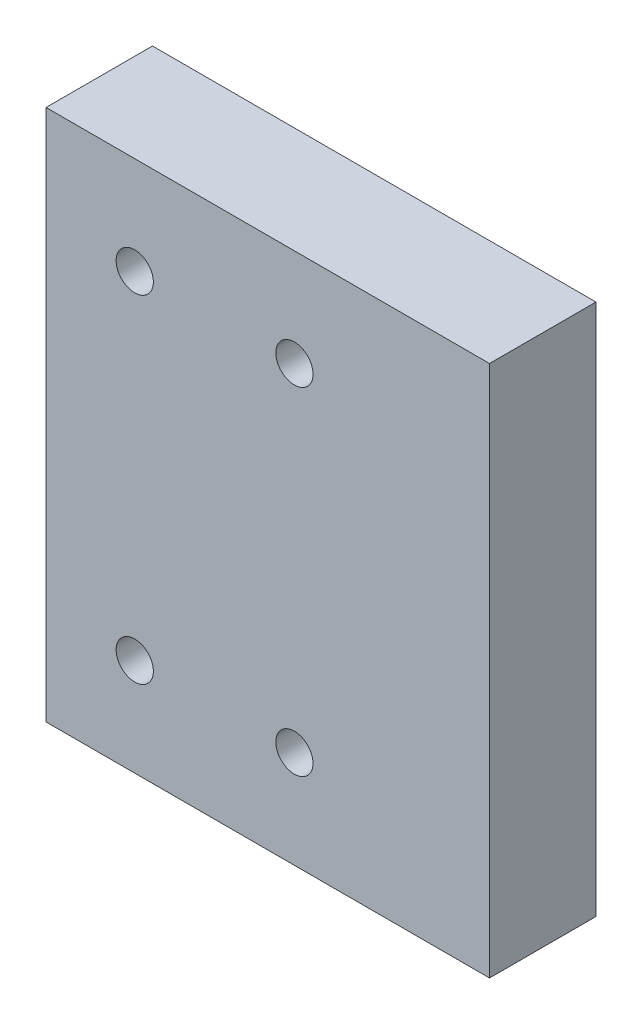
ISO-10303-21;
HEADER;
FILE_DESCRIPTION(('STEP AP214'),'2;1');
FILE_NAME('part.step','',(''),(''),'','','');
FILE_SCHEMA(('AUTOMOTIVE_DESIGN { 1 0 10303 214 1 1 1 1 }'));
ENDSEC;
DATA;
#1=APPLICATION_CONTEXT('core data for automotive mechanical design processes');
#2=APPLICATION_PROTOCOL_DEFINITION('international standard','automotive_design',2000,#1);
#3=PRODUCT_CONTEXT('',#1,'mechanical');
#4=PRODUCT('Part','Part','',(#3));
#5=PRODUCT_RELATED_PRODUCT_CATEGORY('part','',(#4));
#6=PRODUCT_DEFINITION_FORMATION('','',#4);
#7=PRODUCT_DEFINITION_CONTEXT('part definition',#1,'design');
#8=PRODUCT_DEFINITION('design','',#6,#7);
#9=PRODUCT_DEFINITION_SHAPE('','',#8);
#10=(LENGTH_UNIT() NAMED_UNIT(*) SI_UNIT(.MILLI.,.METRE.));
#11=(NAMED_UNIT(*) PLANE_ANGLE_UNIT() SI_UNIT($,.RADIAN.));
#12=(NAMED_UNIT(*) SI_UNIT($,.STERADIAN.) SOLID_ANGLE_UNIT());
#13=UNCERTAINTY_MEASURE_WITH_UNIT(LENGTH_MEASURE(1.E-05),#10,'distance_accuracy_value','');
#14=(GEOMETRIC_REPRESENTATION_CONTEXT(3) GLOBAL_UNCERTAINTY_ASSIGNED_CONTEXT((#13)) GLOBAL_UNIT_ASSIGNED_CONTEXT((#10,
#11,#12)) REPRESENTATION_CONTEXT('',''));
#15=CARTESIAN_POINT('',(0.,0.,0.));
#16=DIRECTION('',(0.,0.,1.));
#17=DIRECTION('',(1.,0.,0.));
#18=AXIS2_PLACEMENT_3D('',#15,#16,#17);
#19=CARTESIAN_POINT('',(-53.,270.,12.));
#20=DIRECTION('',(-1.,0.,0.));
#21=DIRECTION('',(0.,-1.,0.));
#22=AXIS2_PLACEMENT_3D('',#19,#20,#21);
#23=PLANE('',#22);
#24=DIRECTION('',(0.,1.,0.));
#25=VECTOR('',#24,1.);
#26=CARTESIAN_POINT('',(-53.,270.,0.));
#27=LINE('',#26,#25);
#28=CARTESIAN_POINT('',(-53.,270.,0.));
#29=VERTEX_POINT('',#28);
#30=CARTESIAN_POINT('',(-53.,330.,0.));
#31=VERTEX_POINT('',#30);
#32=EDGE_CURVE('E98',#29,#31,#27,.T.);
#33=ORIENTED_EDGE('',*,*,#32,.T.);
#34=DIRECTION('',(0.,0.,-1.));
#35=VECTOR('',#34,1.);
#36=CARTESIAN_POINT('',(-53.,330.,12.));
#37=LINE('',#36,#35);
#38=CARTESIAN_POINT('',(-53.,330.,12.));
#39=VERTEX_POINT('',#38);
#40=EDGE_CURVE('E11',#39,#31,#37,.T.);
#41=ORIENTED_EDGE('',*,*,#40,.F.);
#42=DIRECTION('',(0.,1.,0.));
#43=VECTOR('',#42,1.);
#44=CARTESIAN_POINT('',(-53.,270.,12.));
#45=LINE('',#44,#43);
#46=CARTESIAN_POINT('',(-53.,270.,12.));
#47=VERTEX_POINT('',#46);
#48=EDGE_CURVE('E86',#47,#39,#45,.T.);
#49=ORIENTED_EDGE('',*,*,#48,.F.);
#50=DIRECTION('',(0.,0.,-1.));
#51=VECTOR('',#50,1.);
#52=CARTESIAN_POINT('',(-53.,270.,12.));
#53=LINE('',#52,#51);
#54=EDGE_CURVE('E94',#47,#29,#53,.T.);
#55=ORIENTED_EDGE('',*,*,#54,.T.);
#56=EDGE_LOOP('',(#33,#41,#49,#55));
#57=FACE_BOUND('',#56,.T.);
#58=ADVANCED_FACE('F35',(#57),#23,.F.);
#59=CARTESIAN_POINT('',(-53.,330.,12.));
#60=DIRECTION('',(0.,-1.,0.));
#61=DIRECTION('',(0.,0.,-1.));
#62=AXIS2_PLACEMENT_3D('',#59,#60,#61);
#63=PLANE('',#62);
#64=DIRECTION('',(-1.,0.,0.));
#65=VECTOR('',#64,1.);
#66=CARTESIAN_POINT('',(-53.,330.,0.));
#67=LINE('',#66,#65);
#68=CARTESIAN_POINT('',(-103.,330.,0.));
#69=VERTEX_POINT('',#68);
#70=EDGE_CURVE('E90',#31,#69,#67,.T.);
#71=ORIENTED_EDGE('',*,*,#70,.T.);
#72=DIRECTION('',(0.,0.,-1.));
#73=VECTOR('',#72,1.);
#74=CARTESIAN_POINT('',(-103.,330.,12.));
#75=LINE('',#74,#73);
#76=CARTESIAN_POINT('',(-103.,330.,12.));
#77=VERTEX_POINT('',#76);
#78=EDGE_CURVE('E43',#77,#69,#75,.T.);
#79=ORIENTED_EDGE('',*,*,#78,.F.);
#80=DIRECTION('',(-1.,0.,0.));
#81=VECTOR('',#80,1.);
#82=CARTESIAN_POINT('',(-53.,330.,12.));
#83=LINE('',#82,#81);
#84=EDGE_CURVE('E81',#39,#77,#83,.T.);
#85=ORIENTED_EDGE('',*,*,#84,.F.);
#86=ORIENTED_EDGE('',*,*,#40,.T.);
#87=EDGE_LOOP('',(#71,#79,#85,#86));
#88=FACE_BOUND('',#87,.T.);
#89=ADVANCED_FACE('F89',(#88),#63,.F.);
#90=CARTESIAN_POINT('',(-103.,270.,12.));
#91=DIRECTION('',(1.,0.,0.));
#92=DIRECTION('',(0.,1.,0.));
#93=AXIS2_PLACEMENT_3D('',#90,#91,#92);
#94=PLANE('',#93);
#95=DIRECTION('',(0.,-1.,0.));
#96=VECTOR('',#95,1.);
#97=CARTESIAN_POINT('',(-103.,270.,0.));
#98=LINE('',#97,#96);
#99=CARTESIAN_POINT('',(-103.,270.,0.));
#100=VERTEX_POINT('',#99);
#101=EDGE_CURVE('E68',#69,#100,#98,.T.);
#102=ORIENTED_EDGE('',*,*,#101,.T.);
#103=DIRECTION('',(0.,0.,-1.));
#104=VECTOR('',#103,1.);
#105=CARTESIAN_POINT('',(-103.,270.,12.));
#106=LINE('',#105,#104);
#107=CARTESIAN_POINT('',(-103.,270.,12.));
#108=VERTEX_POINT('',#107);
#109=EDGE_CURVE('E91',#108,#100,#106,.T.);
#110=ORIENTED_EDGE('',*,*,#109,.F.);
#111=DIRECTION('',(0.,-1.,0.));
#112=VECTOR('',#111,1.);
#113=CARTESIAN_POINT('',(-103.,270.,12.));
#114=LINE('',#113,#112);
#115=EDGE_CURVE('E84',#77,#108,#114,.T.);
#116=ORIENTED_EDGE('',*,*,#115,.F.);
#117=ORIENTED_EDGE('',*,*,#78,.T.);
#118=EDGE_LOOP('',(#102,#110,#116,#117));
#119=FACE_BOUND('',#118,.T.);
#120=ADVANCED_FACE('F92',(#119),#94,.F.);
#121=CARTESIAN_POINT('',(-53.,270.,12.));
#122=DIRECTION('',(0.,1.,0.));
#123=DIRECTION('',(0.,0.,1.));
#124=AXIS2_PLACEMENT_3D('',#121,#122,#123);
#125=PLANE('',#124);
#126=DIRECTION('',(1.,0.,0.));
#127=VECTOR('',#126,1.);
#128=CARTESIAN_POINT('',(-53.,270.,0.));
#129=LINE('',#128,#127);
#130=EDGE_CURVE('E74',#100,#29,#129,.T.);
#131=ORIENTED_EDGE('',*,*,#130,.T.);
#132=ORIENTED_EDGE('',*,*,#54,.F.);
#133=DIRECTION('',(1.,0.,0.));
#134=VECTOR('',#133,1.);
#135=CARTESIAN_POINT('',(-53.,270.,12.));
#136=LINE('',#135,#134);
#137=EDGE_CURVE('E51',#108,#47,#136,.T.);
#138=ORIENTED_EDGE('',*,*,#137,.F.);
#139=ORIENTED_EDGE('',*,*,#109,.T.);
#140=EDGE_LOOP('',(#131,#132,#138,#139));
#141=FACE_BOUND('',#140,.T.);
#142=ADVANCED_FACE('F106',(#141),#125,.F.);
#143=CARTESIAN_POINT('',(0.,0.,12.));
#144=DIRECTION('',(0.,0.,1.));
#145=DIRECTION('',(1.,0.,0.));
#146=AXIS2_PLACEMENT_3D('',#143,#144,#145);
#147=PLANE('',#146);
#148=CARTESIAN_POINT('',(-93.,319.,12.));
#149=DIRECTION('',(0.,0.,1.));
#150=DIRECTION('',(1.,0.,0.));
#151=AXIS2_PLACEMENT_3D('',#148,#149,#150);
#152=CIRCLE('',#151,2.09999999999999);
#153=CARTESIAN_POINT('',(-90.9,319.,12.));
#154=VERTEX_POINT('',#153);
#155=EDGE_CURVE('E132',#154,#154,#152,.T.);
#156=ORIENTED_EDGE('',*,*,#155,.F.);
#157=EDGE_LOOP('',(#156));
#158=FACE_BOUND('',#157,.T.);
#159=CARTESIAN_POINT('',(-75.,319.,12.));
#160=DIRECTION('',(0.,0.,1.));
#161=DIRECTION('',(1.,0.,0.));
#162=AXIS2_PLACEMENT_3D('',#159,#160,#161);
#163=CIRCLE('',#162,2.09999999999999);
#164=CARTESIAN_POINT('',(-72.9,319.,12.));
#165=VERTEX_POINT('',#164);
#166=EDGE_CURVE('E126',#165,#165,#163,.T.);
#167=ORIENTED_EDGE('',*,*,#166,.F.);
#168=EDGE_LOOP('',(#167));
#169=FACE_BOUND('',#168,.T.);
#170=CARTESIAN_POINT('',(-75.,281.,12.));
#171=DIRECTION('',(0.,0.,1.));
#172=DIRECTION('',(1.,0.,0.));
#173=AXIS2_PLACEMENT_3D('',#170,#171,#172);
#174=CIRCLE('',#173,2.09999999999999);
#175=CARTESIAN_POINT('',(-72.9,281.,12.));
#176=VERTEX_POINT('',#175);
#177=EDGE_CURVE('E120',#176,#176,#174,.T.);
#178=ORIENTED_EDGE('',*,*,#177,.F.);
#179=EDGE_LOOP('',(#178));
#180=FACE_BOUND('',#179,.T.);
#181=CARTESIAN_POINT('',(-93.,281.,12.));
#182=DIRECTION('',(0.,0.,1.));
#183=DIRECTION('',(1.,0.,0.));
#184=AXIS2_PLACEMENT_3D('',#181,#182,#183);
#185=CIRCLE('',#184,2.09999999999999);
#186=CARTESIAN_POINT('',(-90.9,281.,12.));
#187=VERTEX_POINT('',#186);
#188=EDGE_CURVE('E114',#187,#187,#185,.T.);
#189=ORIENTED_EDGE('',*,*,#188,.F.);
#190=EDGE_LOOP('',(#189));
#191=FACE_BOUND('',#190,.T.);
#192=ORIENTED_EDGE('',*,*,#48,.T.);
#193=ORIENTED_EDGE('',*,*,#84,.T.);
#194=ORIENTED_EDGE('',*,*,#115,.T.);
#195=ORIENTED_EDGE('',*,*,#137,.T.);
#196=EDGE_LOOP('',(#192,#193,#194,#195));
#197=FACE_BOUND('',#196,.T.);
#198=ADVANCED_FACE('F82',(#158,#169,#180,#191,#197),#147,.T.);
#199=CARTESIAN_POINT('',(0.,0.,0.));
#200=DIRECTION('',(0.,0.,1.));
#201=DIRECTION('',(1.,0.,0.));
#202=AXIS2_PLACEMENT_3D('',#199,#200,#201);
#203=PLANE('',#202);
#204=CARTESIAN_POINT('',(-93.,319.,0.));
#205=DIRECTION('',(0.,0.,1.));
#206=DIRECTION('',(1.,0.,0.));
#207=AXIS2_PLACEMENT_3D('',#204,#205,#206);
#208=CIRCLE('',#207,2.09999999999999);
#209=CARTESIAN_POINT('',(-90.9,319.,0.));
#210=VERTEX_POINT('',#209);
#211=EDGE_CURVE('E129',#210,#210,#208,.T.);
#212=ORIENTED_EDGE('',*,*,#211,.T.);
#213=EDGE_LOOP('',(#212));
#214=FACE_BOUND('',#213,.T.);
#215=CARTESIAN_POINT('',(-75.,319.,0.));
#216=DIRECTION('',(0.,0.,1.));
#217=DIRECTION('',(1.,0.,0.));
#218=AXIS2_PLACEMENT_3D('',#215,#216,#217);
#219=CIRCLE('',#218,2.09999999999999);
#220=CARTESIAN_POINT('',(-72.9,319.,0.));
#221=VERTEX_POINT('',#220);
#222=EDGE_CURVE('E123',#221,#221,#219,.T.);
#223=ORIENTED_EDGE('',*,*,#222,.T.);
#224=EDGE_LOOP('',(#223));
#225=FACE_BOUND('',#224,.T.);
#226=CARTESIAN_POINT('',(-75.,281.,0.));
#227=DIRECTION('',(0.,0.,1.));
#228=DIRECTION('',(1.,0.,0.));
#229=AXIS2_PLACEMENT_3D('',#226,#227,#228);
#230=CIRCLE('',#229,2.09999999999999);
#231=CARTESIAN_POINT('',(-72.9,281.,0.));
#232=VERTEX_POINT('',#231);
#233=EDGE_CURVE('E117',#232,#232,#230,.T.);
#234=ORIENTED_EDGE('',*,*,#233,.T.);
#235=EDGE_LOOP('',(#234));
#236=FACE_BOUND('',#235,.T.);
#237=CARTESIAN_POINT('',(-93.,281.,0.));
#238=DIRECTION('',(0.,0.,1.));
#239=DIRECTION('',(1.,0.,0.));
#240=AXIS2_PLACEMENT_3D('',#237,#238,#239);
#241=CIRCLE('',#240,2.09999999999999);
#242=CARTESIAN_POINT('',(-90.9,281.,0.));
#243=VERTEX_POINT('',#242);
#244=EDGE_CURVE('E101',#243,#243,#241,.T.);
#245=ORIENTED_EDGE('',*,*,#244,.T.);
#246=EDGE_LOOP('',(#245));
#247=FACE_BOUND('',#246,.T.);
#248=ORIENTED_EDGE('',*,*,#32,.F.);
#249=ORIENTED_EDGE('',*,*,#130,.F.);
#250=ORIENTED_EDGE('',*,*,#101,.F.);
#251=ORIENTED_EDGE('',*,*,#70,.F.);
#252=EDGE_LOOP('',(#248,#249,#250,#251));
#253=FACE_BOUND('',#252,.T.);
#254=ADVANCED_FACE('F109',(#214,#225,#236,#247,#253),#203,.F.);
#255=CARTESIAN_POINT('',(-93.,281.,12.));
#256=DIRECTION('',(0.,0.,1.));
#257=DIRECTION('',(1.,0.,0.));
#258=AXIS2_PLACEMENT_3D('',#255,#256,#257);
#259=CYLINDRICAL_SURFACE('',#258,2.09999999999999);
#260=ORIENTED_EDGE('',*,*,#244,.F.);
#261=EDGE_LOOP('',(#260));
#262=FACE_BOUND('',#261,.T.);
#263=ORIENTED_EDGE('',*,*,#188,.T.);
#264=EDGE_LOOP('',(#263));
#265=FACE_BOUND('',#264,.T.);
#266=ADVANCED_FACE('F147',(#262,#265),#259,.F.);
#267=CARTESIAN_POINT('',(-75.,281.,12.));
#268=DIRECTION('',(0.,0.,1.));
#269=DIRECTION('',(1.,0.,0.));
#270=AXIS2_PLACEMENT_3D('',#267,#268,#269);
#271=CYLINDRICAL_SURFACE('',#270,2.09999999999999);
#272=ORIENTED_EDGE('',*,*,#233,.F.);
#273=EDGE_LOOP('',(#272));
#274=FACE_BOUND('',#273,.T.);
#275=ORIENTED_EDGE('',*,*,#177,.T.);
#276=EDGE_LOOP('',(#275));
#277=FACE_BOUND('',#276,.T.);
#278=ADVANCED_FACE('F149',(#274,#277),#271,.F.);
#279=CARTESIAN_POINT('',(-75.,319.,12.));
#280=DIRECTION('',(0.,0.,1.));
#281=DIRECTION('',(1.,0.,0.));
#282=AXIS2_PLACEMENT_3D('',#279,#280,#281);
#283=CYLINDRICAL_SURFACE('',#282,2.09999999999999);
#284=ORIENTED_EDGE('',*,*,#222,.F.);
#285=EDGE_LOOP('',(#284));
#286=FACE_BOUND('',#285,.T.);
#287=ORIENTED_EDGE('',*,*,#166,.T.);
#288=EDGE_LOOP('',(#287));
#289=FACE_BOUND('',#288,.T.);
#290=ADVANCED_FACE('F156',(#286,#289),#283,.F.);
#291=CARTESIAN_POINT('',(-93.,319.,12.));
#292=DIRECTION('',(0.,0.,1.));
#293=DIRECTION('',(1.,0.,0.));
#294=AXIS2_PLACEMENT_3D('',#291,#292,#293);
#295=CYLINDRICAL_SURFACE('',#294,2.09999999999999);
#296=ORIENTED_EDGE('',*,*,#211,.F.);
#297=EDGE_LOOP('',(#296));
#298=FACE_BOUND('',#297,.T.);
#299=ORIENTED_EDGE('',*,*,#155,.T.);
#300=EDGE_LOOP('',(#299));
#301=FACE_BOUND('',#300,.T.);
#302=ADVANCED_FACE('F136',(#298,#301),#295,.F.);
#303=CLOSED_SHELL('',(#58,#89,#120,#142,#198,#254,#266,#278,#290,#302));
#304=MANIFOLD_SOLID_BREP('B2',#303);
#305=ADVANCED_BREP_SHAPE_REPRESENTATION('',(#18,#304),#14);
#306=SHAPE_DEFINITION_REPRESENTATION(#9,#305);
ENDSEC;
END-ISO-10303-21;
